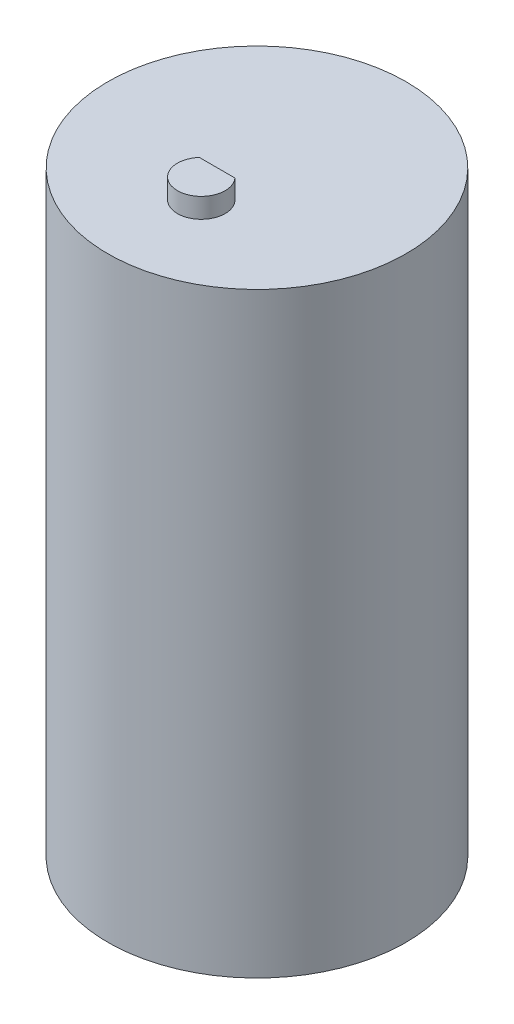
ISO-10303-21;
HEADER;
FILE_DESCRIPTION(('STEP AP214'),'2;1');
FILE_NAME('part.step','',(''),(''),'','','');
FILE_SCHEMA(('AUTOMOTIVE_DESIGN { 1 0 10303 214 1 1 1 1 }'));
ENDSEC;
DATA;
#1=APPLICATION_CONTEXT('core data for automotive mechanical design processes');
#2=APPLICATION_PROTOCOL_DEFINITION('international standard','automotive_design',2000,#1);
#3=PRODUCT_CONTEXT('',#1,'mechanical');
#4=PRODUCT('Part','Part','',(#3));
#5=PRODUCT_RELATED_PRODUCT_CATEGORY('part','',(#4));
#6=PRODUCT_DEFINITION_FORMATION('','',#4);
#7=PRODUCT_DEFINITION_CONTEXT('part definition',#1,'design');
#8=PRODUCT_DEFINITION('design','',#6,#7);
#9=PRODUCT_DEFINITION_SHAPE('','',#8);
#10=(LENGTH_UNIT() NAMED_UNIT(*) SI_UNIT(.MILLI.,.METRE.));
#11=(NAMED_UNIT(*) PLANE_ANGLE_UNIT() SI_UNIT($,.RADIAN.));
#12=(NAMED_UNIT(*) SI_UNIT($,.STERADIAN.) SOLID_ANGLE_UNIT());
#13=UNCERTAINTY_MEASURE_WITH_UNIT(LENGTH_MEASURE(1.E-05),#10,'distance_accuracy_value','');
#14=(GEOMETRIC_REPRESENTATION_CONTEXT(3) GLOBAL_UNCERTAINTY_ASSIGNED_CONTEXT((#13)) GLOBAL_UNIT_ASSIGNED_CONTEXT((#10,
#11,#12)) REPRESENTATION_CONTEXT('',''));
#15=CARTESIAN_POINT('',(0.,0.,0.));
#16=DIRECTION('',(0.,0.,1.));
#17=DIRECTION('',(1.,0.,0.));
#18=AXIS2_PLACEMENT_3D('',#15,#16,#17);
#19=CARTESIAN_POINT('',(0.,76.2,0.));
#20=DIRECTION('',(0.,-1.,0.));
#21=DIRECTION('',(0.,0.,-1.));
#22=AXIS2_PLACEMENT_3D('',#19,#20,#21);
#23=CYLINDRICAL_SURFACE('',#22,19.05);
#24=CARTESIAN_POINT('',(0.,76.2,0.));
#25=DIRECTION('',(0.,1.,0.));
#26=DIRECTION('',(0.,0.,1.));
#27=AXIS2_PLACEMENT_3D('',#24,#25,#26);
#28=CIRCLE('',#27,19.05);
#29=CARTESIAN_POINT('',(0.,76.2,-19.05));
#30=VERTEX_POINT('',#29);
#31=EDGE_CURVE('E11',#30,#30,#28,.T.);
#32=CARTESIAN_POINT('',(0.,0.,0.));
#33=DIRECTION('',(0.,1.,0.));
#34=DIRECTION('',(0.,0.,1.));
#35=AXIS2_PLACEMENT_3D('',#32,#33,#34);
#36=CIRCLE('',#35,19.05);
#37=CARTESIAN_POINT('',(0.,0.,-19.05));
#38=VERTEX_POINT('',#37);
#39=EDGE_CURVE('E37',#38,#38,#36,.T.);
#40=CARTESIAN_POINT('',(0.,76.2,-19.05));
#41=CARTESIAN_POINT('',(0.,75.40625,-19.05));
#42=CARTESIAN_POINT('',(0.,74.6125,-19.05));
#43=CARTESIAN_POINT('',(0.,73.025,-19.05));
#44=CARTESIAN_POINT('',(0.,72.23125,-19.05));
#45=CARTESIAN_POINT('',(0.,70.64375,-19.05));
#46=CARTESIAN_POINT('',(0.,69.85,-19.05));
#47=CARTESIAN_POINT('',(0.,68.2625,-19.05));
#48=CARTESIAN_POINT('',(0.,67.46875,-19.05));
#49=CARTESIAN_POINT('',(0.,65.88125,-19.05));
#50=CARTESIAN_POINT('',(0.,65.0875,-19.05));
#51=CARTESIAN_POINT('',(0.,63.5,-19.05));
#52=CARTESIAN_POINT('',(0.,62.70625,-19.05));
#53=CARTESIAN_POINT('',(0.,61.11875,-19.05));
#54=CARTESIAN_POINT('',(0.,60.325,-19.05));
#55=CARTESIAN_POINT('',(0.,58.7375,-19.05));
#56=CARTESIAN_POINT('',(0.,57.94375,-19.05));
#57=CARTESIAN_POINT('',(0.,56.35625,-19.05));
#58=CARTESIAN_POINT('',(0.,55.5625,-19.05));
#59=CARTESIAN_POINT('',(0.,53.975,-19.05));
#60=CARTESIAN_POINT('',(0.,53.18125,-19.05));
#61=CARTESIAN_POINT('',(0.,51.59375,-19.05));
#62=CARTESIAN_POINT('',(0.,50.8,-19.05));
#63=CARTESIAN_POINT('',(0.,49.2125,-19.05));
#64=CARTESIAN_POINT('',(0.,48.41875,-19.05));
#65=CARTESIAN_POINT('',(0.,46.83125,-19.05));
#66=CARTESIAN_POINT('',(0.,46.0375,-19.05));
#67=CARTESIAN_POINT('',(0.,44.45,-19.05));
#68=CARTESIAN_POINT('',(0.,43.65625,-19.05));
#69=CARTESIAN_POINT('',(0.,42.06875,-19.05));
#70=CARTESIAN_POINT('',(0.,41.275,-19.05));
#71=CARTESIAN_POINT('',(0.,39.6875,-19.05));
#72=CARTESIAN_POINT('',(0.,38.89375,-19.05));
#73=CARTESIAN_POINT('',(0.,37.30625,-19.05));
#74=CARTESIAN_POINT('',(0.,36.5125,-19.05));
#75=CARTESIAN_POINT('',(0.,34.925,-19.05));
#76=CARTESIAN_POINT('',(0.,34.13125,-19.05));
#77=CARTESIAN_POINT('',(0.,32.54375,-19.05));
#78=CARTESIAN_POINT('',(0.,31.75,-19.05));
#79=CARTESIAN_POINT('',(0.,30.1625,-19.05));
#80=CARTESIAN_POINT('',(0.,29.36875,-19.05));
#81=CARTESIAN_POINT('',(0.,27.78125,-19.05));
#82=CARTESIAN_POINT('',(0.,26.9875,-19.05));
#83=CARTESIAN_POINT('',(0.,25.4,-19.05));
#84=CARTESIAN_POINT('',(0.,24.60625,-19.05));
#85=CARTESIAN_POINT('',(0.,23.01875,-19.05));
#86=CARTESIAN_POINT('',(0.,22.225,-19.05));
#87=CARTESIAN_POINT('',(0.,20.6375,-19.05));
#88=CARTESIAN_POINT('',(0.,19.84375,-19.05));
#89=CARTESIAN_POINT('',(0.,18.25625,-19.05));
#90=CARTESIAN_POINT('',(0.,17.4625,-19.05));
#91=CARTESIAN_POINT('',(0.,15.875,-19.05));
#92=CARTESIAN_POINT('',(0.,15.08125,-19.05));
#93=CARTESIAN_POINT('',(0.,13.49375,-19.05));
#94=CARTESIAN_POINT('',(0.,12.7,-19.05));
#95=CARTESIAN_POINT('',(0.,11.1125,-19.05));
#96=CARTESIAN_POINT('',(0.,10.31875,-19.05));
#97=CARTESIAN_POINT('',(0.,8.73125,-19.05));
#98=CARTESIAN_POINT('',(0.,7.93750000000001,-19.05));
#99=CARTESIAN_POINT('',(0.,6.35,-19.05));
#100=CARTESIAN_POINT('',(0.,5.55625,-19.05));
#101=CARTESIAN_POINT('',(0.,3.96875,-19.05));
#102=CARTESIAN_POINT('',(0.,3.175,-19.05));
#103=CARTESIAN_POINT('',(0.,1.5875,-19.05));
#104=CARTESIAN_POINT('',(0.,0.793750000000001,-19.05));
#105=CARTESIAN_POINT('',(0.,0.,-19.05));
#106=B_SPLINE_CURVE_WITH_KNOTS('',3,(#40,#41,#42,#43,#44,#45,#46,#47,#48,#49,#50,#51,#52,#53,
#54,#55,#56,#57,#58,#59,#60,#61,#62,#63,#64,#65,#66,#67,#68,#69,#70,#71,#72,#73,#74,#75,#76,#77,
#78,#79,#80,#81,#82,#83,#84,#85,#86,#87,#88,#89,#90,#91,#92,#93,#94,#95,#96,#97,#98,#99,#100,
#101,#102,#103,#104,#105),.UNSPECIFIED.,.F.,.F.,(4,2,2,2,2,2,2,2,2,2,2,2,2,2,2,2,2,2,2,2,2,2,2,
2,2,2,2,2,2,2,2,2,4),(0.,2.38125,4.7625,7.14375,9.52500000000001,11.90625,14.2875,16.66875,
19.05,21.43125,23.8125,26.19375,28.575,30.95625,33.3375,35.71875,38.1,40.48125,42.8625,45.24375,
47.625,50.00625,52.3875,54.76875,57.15,59.53125,61.9125,64.29375,66.675,69.05625,71.4375,
73.81875,76.2),.UNSPECIFIED.);
#107=EDGE_CURVE('BSEAM34',#30,#38,#106,.T.);
#108=ORIENTED_EDGE('',*,*,#31,.F.);
#109=ORIENTED_EDGE('',*,*,#39,.T.);
#110=ORIENTED_EDGE('',*,*,#107,.T.);
#111=ORIENTED_EDGE('',*,*,#107,.F.);
#112=EDGE_LOOP('',(#108,#110,#109,#111));
#113=FACE_BOUND('',#112,.T.);
#114=ADVANCED_FACE('F34',(#113),#23,.T.);
#115=CARTESIAN_POINT('',(0.,76.2,0.));
#116=DIRECTION('',(0.,1.,0.));
#117=DIRECTION('',(0.,0.,1.));
#118=AXIS2_PLACEMENT_3D('',#115,#116,#117);
#119=PLANE('',#118);
#120=CARTESIAN_POINT('',(0.,76.2,7.112));
#121=DIRECTION('',(0.,1.,0.));
#122=DIRECTION('',(0.,0.,1.));
#123=AXIS2_PLACEMENT_3D('',#120,#121,#122);
#124=CIRCLE('',#123,3.048);
#125=CARTESIAN_POINT('',(-2.27332811364448,76.2,5.08165931732784));
#126=VERTEX_POINT('',#125);
#127=CARTESIAN_POINT('',(2.27332811364448,76.2,5.08165931732784));
#128=VERTEX_POINT('',#127);
#129=EDGE_CURVE('E63',#126,#128,#124,.T.);
#130=ORIENTED_EDGE('',*,*,#129,.F.);
#131=DIRECTION('',(-1.,0.,0.));
#132=VECTOR('',#131,1.);
#133=CARTESIAN_POINT('',(0.,76.2,5.08165931732784));
#134=LINE('',#133,#132);
#135=EDGE_CURVE('E48',#128,#126,#134,.T.);
#136=ORIENTED_EDGE('',*,*,#135,.F.);
#137=EDGE_LOOP('',(#130,#136));
#138=FACE_BOUND('',#137,.T.);
#139=ORIENTED_EDGE('',*,*,#31,.T.);
#140=EDGE_LOOP('',(#139));
#141=FACE_BOUND('',#140,.T.);
#142=ADVANCED_FACE('F73',(#138,#141),#119,.T.);
#143=CARTESIAN_POINT('',(0.,0.,0.));
#144=DIRECTION('',(0.,1.,0.));
#145=DIRECTION('',(0.,0.,1.));
#146=AXIS2_PLACEMENT_3D('',#143,#144,#145);
#147=PLANE('',#146);
#148=ORIENTED_EDGE('',*,*,#39,.F.);
#149=EDGE_LOOP('',(#148));
#150=FACE_BOUND('',#149,.T.);
#151=ADVANCED_FACE('F83',(#150),#147,.F.);
#152=CARTESIAN_POINT('',(0.,78.74,5.08165931732784));
#153=DIRECTION('',(0.,0.,1.));
#154=DIRECTION('',(1.,0.,0.));
#155=AXIS2_PLACEMENT_3D('',#152,#153,#154);
#156=PLANE('',#155);
#157=ORIENTED_EDGE('',*,*,#135,.T.);
#158=DIRECTION('',(0.,-1.,0.));
#159=VECTOR('',#158,1.);
#160=CARTESIAN_POINT('',(-2.27332811364448,78.74,5.08165931732784));
#161=LINE('',#160,#159);
#162=CARTESIAN_POINT('',(-2.27332811364448,78.74,5.08165931732784));
#163=VERTEX_POINT('',#162);
#164=EDGE_CURVE('E67',#163,#126,#161,.T.);
#165=ORIENTED_EDGE('',*,*,#164,.F.);
#166=DIRECTION('',(-1.,0.,0.));
#167=VECTOR('',#166,1.);
#168=CARTESIAN_POINT('',(0.,78.74,5.08165931732784));
#169=LINE('',#168,#167);
#170=CARTESIAN_POINT('',(2.27332811364448,78.74,5.08165931732784));
#171=VERTEX_POINT('',#170);
#172=EDGE_CURVE('E69',#171,#163,#169,.T.);
#173=ORIENTED_EDGE('',*,*,#172,.F.);
#174=DIRECTION('',(0.,-1.,0.));
#175=VECTOR('',#174,1.);
#176=CARTESIAN_POINT('',(2.27332811364448,78.74,5.08165931732784));
#177=LINE('',#176,#175);
#178=EDGE_CURVE('E65',#171,#128,#177,.T.);
#179=ORIENTED_EDGE('',*,*,#178,.T.);
#180=EDGE_LOOP('',(#157,#165,#173,#179));
#181=FACE_BOUND('',#180,.T.);
#182=ADVANCED_FACE('F71',(#181),#156,.F.);
#183=CARTESIAN_POINT('',(0.,78.74,7.112));
#184=DIRECTION('',(0.,-1.,0.));
#185=DIRECTION('',(0.,0.,-1.));
#186=AXIS2_PLACEMENT_3D('',#183,#184,#185);
#187=CYLINDRICAL_SURFACE('',#186,3.048);
#188=ORIENTED_EDGE('',*,*,#129,.T.);
#189=ORIENTED_EDGE('',*,*,#178,.F.);
#190=CARTESIAN_POINT('',(0.,78.74,7.112));
#191=DIRECTION('',(0.,1.,0.));
#192=DIRECTION('',(0.,0.,1.));
#193=AXIS2_PLACEMENT_3D('',#190,#191,#192);
#194=CIRCLE('',#193,3.048);
#195=EDGE_CURVE('E56',#163,#171,#194,.T.);
#196=ORIENTED_EDGE('',*,*,#195,.F.);
#197=ORIENTED_EDGE('',*,*,#164,.T.);
#198=EDGE_LOOP('',(#188,#189,#196,#197));
#199=FACE_BOUND('',#198,.T.);
#200=ADVANCED_FACE('F64',(#199),#187,.T.);
#201=CARTESIAN_POINT('',(0.,78.74,0.));
#202=DIRECTION('',(0.,1.,0.));
#203=DIRECTION('',(0.,0.,1.));
#204=AXIS2_PLACEMENT_3D('',#201,#202,#203);
#205=PLANE('',#204);
#206=ORIENTED_EDGE('',*,*,#172,.T.);
#207=ORIENTED_EDGE('',*,*,#195,.T.);
#208=EDGE_LOOP('',(#206,#207));
#209=FACE_BOUND('',#208,.T.);
#210=ADVANCED_FACE('F118',(#209),#205,.T.);
#211=CLOSED_SHELL('',(#114,#142,#151,#182,#200,#210));
#212=MANIFOLD_SOLID_BREP('B2',#211);
#213=ADVANCED_BREP_SHAPE_REPRESENTATION('',(#18,#212),#14);
#214=SHAPE_DEFINITION_REPRESENTATION(#9,#213);
ENDSEC;
END-ISO-10303-21;
